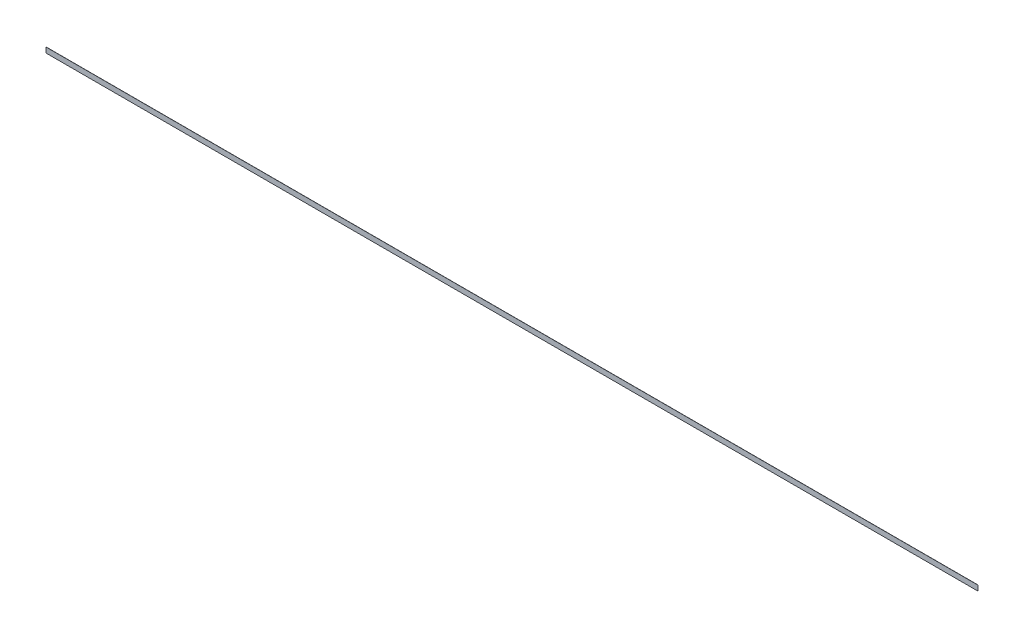
ISO-10303-21;
HEADER;
FILE_DESCRIPTION(('STEP AP214'),'2;1');
FILE_NAME('part.step','',(''),(''),'','','');
FILE_SCHEMA(('AUTOMOTIVE_DESIGN { 1 0 10303 214 1 1 1 1 }'));
ENDSEC;
DATA;
#1=APPLICATION_CONTEXT('core data for automotive mechanical design processes');
#2=APPLICATION_PROTOCOL_DEFINITION('international standard','automotive_design',2000,#1);
#3=PRODUCT_CONTEXT('',#1,'mechanical');
#4=PRODUCT('Part','Part','',(#3));
#5=PRODUCT_RELATED_PRODUCT_CATEGORY('part','',(#4));
#6=PRODUCT_DEFINITION_FORMATION('','',#4);
#7=PRODUCT_DEFINITION_CONTEXT('part definition',#1,'design');
#8=PRODUCT_DEFINITION('design','',#6,#7);
#9=PRODUCT_DEFINITION_SHAPE('','',#8);
#10=(LENGTH_UNIT() NAMED_UNIT(*) SI_UNIT(.MILLI.,.METRE.));
#11=(NAMED_UNIT(*) PLANE_ANGLE_UNIT() SI_UNIT($,.RADIAN.));
#12=(NAMED_UNIT(*) SI_UNIT($,.STERADIAN.) SOLID_ANGLE_UNIT());
#13=UNCERTAINTY_MEASURE_WITH_UNIT(LENGTH_MEASURE(1.E-05),#10,'distance_accuracy_value','');
#14=(GEOMETRIC_REPRESENTATION_CONTEXT(3) GLOBAL_UNCERTAINTY_ASSIGNED_CONTEXT((#13)) GLOBAL_UNIT_ASSIGNED_CONTEXT((#10,
#11,#12)) REPRESENTATION_CONTEXT('',''));
#15=CARTESIAN_POINT('',(0.,0.,0.));
#16=DIRECTION('',(0.,0.,1.));
#17=DIRECTION('',(1.,0.,0.));
#18=AXIS2_PLACEMENT_3D('',#15,#16,#17);
#19=CARTESIAN_POINT('',(-4761.02167367934,852.935817998678,0.));
#20=DIRECTION('',(0.,0.,1.));
#21=DIRECTION('',(1.,0.,0.));
#22=AXIS2_PLACEMENT_3D('',#19,#20,#21);
#23=PLANE('',#22);
#24=DIRECTION('',(1.,0.,0.));
#25=VECTOR('',#24,1.);
#26=CARTESIAN_POINT('',(-4761.02167367934,827.535817998678,0.));
#27=LINE('',#26,#25);
#28=CARTESIAN_POINT('',(-290.621673679351,827.535817998678,0.));
#29=VERTEX_POINT('',#28);
#30=CARTESIAN_POINT('',(-9333.02167367934,827.535817998678,0.));
#31=VERTEX_POINT('',#30);
#32=EDGE_CURVE('E20',#29,#31,#27,.F.);
#33=ORIENTED_EDGE('',*,*,#32,.T.);
#34=DIRECTION('',(0.,1.,0.));
#35=VECTOR('',#34,1.);
#36=CARTESIAN_POINT('',(-9333.02167367934,852.935817998678,0.));
#37=LINE('',#36,#35);
#38=CARTESIAN_POINT('',(-9333.02167367934,878.335817998678,0.));
#39=VERTEX_POINT('',#38);
#40=EDGE_CURVE('E79',#31,#39,#37,.T.);
#41=ORIENTED_EDGE('',*,*,#40,.T.);
#42=DIRECTION('',(1.,0.,0.));
#43=VECTOR('',#42,1.);
#44=CARTESIAN_POINT('',(-4761.02167367934,878.335817998678,0.));
#45=LINE('',#44,#43);
#46=CARTESIAN_POINT('',(-290.621673679351,878.335817998678,0.));
#47=VERTEX_POINT('',#46);
#48=EDGE_CURVE('E68',#47,#39,#45,.F.);
#49=ORIENTED_EDGE('',*,*,#48,.F.);
#50=DIRECTION('',(0.,1.,0.));
#51=VECTOR('',#50,1.);
#52=CARTESIAN_POINT('',(-290.621673679351,852.935817998678,0.));
#53=LINE('',#52,#51);
#54=EDGE_CURVE('E56',#29,#47,#53,.T.);
#55=ORIENTED_EDGE('',*,*,#54,.F.);
#56=EDGE_LOOP('',(#33,#41,#49,#55));
#57=FACE_BOUND('',#56,.T.);
#58=ADVANCED_FACE('F17',(#57),#23,.F.);
#59=CARTESIAN_POINT('',(-4761.02167367934,827.535817998678,3.175));
#60=DIRECTION('',(0.,1.,0.));
#61=DIRECTION('',(0.,0.,1.));
#62=AXIS2_PLACEMENT_3D('',#59,#60,#61);
#63=PLANE('',#62);
#64=DIRECTION('',(1.,0.,0.));
#65=VECTOR('',#64,1.);
#66=CARTESIAN_POINT('',(-4761.02167367934,827.535817998678,1.5875));
#67=LINE('',#66,#65);
#68=CARTESIAN_POINT('',(-9333.02167367934,827.535817998678,1.5875));
#69=VERTEX_POINT('',#68);
#70=CARTESIAN_POINT('',(-290.621673679351,827.535817998678,1.5875));
#71=VERTEX_POINT('',#70);
#72=EDGE_CURVE('E83',#69,#71,#67,.T.);
#73=ORIENTED_EDGE('',*,*,#72,.F.);
#74=DIRECTION('',(0.,0.,-1.));
#75=VECTOR('',#74,1.);
#76=CARTESIAN_POINT('',(-9333.02167367934,827.535817998678,3.175));
#77=LINE('',#76,#75);
#78=EDGE_CURVE('E65',#69,#31,#77,.T.);
#79=ORIENTED_EDGE('',*,*,#78,.T.);
#80=ORIENTED_EDGE('',*,*,#32,.F.);
#81=DIRECTION('',(0.,0.,-1.));
#82=VECTOR('',#81,1.);
#83=CARTESIAN_POINT('',(-290.621673679351,827.535817998678,3.175));
#84=LINE('',#83,#82);
#85=EDGE_CURVE('E62',#71,#29,#84,.T.);
#86=ORIENTED_EDGE('',*,*,#85,.F.);
#87=EDGE_LOOP('',(#73,#79,#80,#86));
#88=FACE_BOUND('',#87,.T.);
#89=ADVANCED_FACE('F61',(#88),#63,.F.);
#90=CARTESIAN_POINT('',(-290.621673679351,852.935817998678,3.175));
#91=DIRECTION('',(1.,0.,0.));
#92=DIRECTION('',(0.,0.,-1.));
#93=AXIS2_PLACEMENT_3D('',#90,#91,#92);
#94=PLANE('',#93);
#95=ORIENTED_EDGE('',*,*,#54,.T.);
#96=DIRECTION('',(0.,0.,1.));
#97=VECTOR('',#96,1.);
#98=CARTESIAN_POINT('',(-290.621673679351,878.335817998678,3.175));
#99=LINE('',#98,#97);
#100=CARTESIAN_POINT('',(-290.621673679351,878.335817998678,1.5875));
#101=VERTEX_POINT('',#100);
#102=EDGE_CURVE('E70',#101,#47,#99,.F.);
#103=ORIENTED_EDGE('',*,*,#102,.F.);
#104=DIRECTION('',(0.,1.,0.));
#105=VECTOR('',#104,1.);
#106=CARTESIAN_POINT('',(-290.621673679351,852.935817998678,1.5875));
#107=LINE('',#106,#105);
#108=EDGE_CURVE('E74',#71,#101,#107,.T.);
#109=ORIENTED_EDGE('',*,*,#108,.F.);
#110=ORIENTED_EDGE('',*,*,#85,.T.);
#111=EDGE_LOOP('',(#95,#103,#109,#110));
#112=FACE_BOUND('',#111,.T.);
#113=ADVANCED_FACE('F72',(#112),#94,.T.);
#114=CARTESIAN_POINT('',(-4761.02167367934,878.335817998678,3.175));
#115=DIRECTION('',(0.,1.,0.));
#116=DIRECTION('',(0.,0.,1.));
#117=AXIS2_PLACEMENT_3D('',#114,#115,#116);
#118=PLANE('',#117);
#119=ORIENTED_EDGE('',*,*,#48,.T.);
#120=DIRECTION('',(0.,0.,-1.));
#121=VECTOR('',#120,1.);
#122=CARTESIAN_POINT('',(-9333.02167367934,878.335817998678,3.175));
#123=LINE('',#122,#121);
#124=CARTESIAN_POINT('',(-9333.02167367934,878.335817998678,1.5875));
#125=VERTEX_POINT('',#124);
#126=EDGE_CURVE('E35',#39,#125,#123,.F.);
#127=ORIENTED_EDGE('',*,*,#126,.T.);
#128=DIRECTION('',(1.,0.,0.));
#129=VECTOR('',#128,1.);
#130=CARTESIAN_POINT('',(-4761.02167367934,878.335817998678,1.5875));
#131=LINE('',#130,#129);
#132=EDGE_CURVE('E26',#101,#125,#131,.F.);
#133=ORIENTED_EDGE('',*,*,#132,.F.);
#134=ORIENTED_EDGE('',*,*,#102,.T.);
#135=EDGE_LOOP('',(#119,#127,#133,#134));
#136=FACE_BOUND('',#135,.T.);
#137=ADVANCED_FACE('F89',(#136),#118,.T.);
#138=CARTESIAN_POINT('',(-9333.02167367934,852.935817998678,3.175));
#139=DIRECTION('',(1.,0.,0.));
#140=DIRECTION('',(0.,0.,-1.));
#141=AXIS2_PLACEMENT_3D('',#138,#139,#140);
#142=PLANE('',#141);
#143=DIRECTION('',(0.,1.,0.));
#144=VECTOR('',#143,1.);
#145=CARTESIAN_POINT('',(-9333.02167367934,852.935817998678,1.5875));
#146=LINE('',#145,#144);
#147=EDGE_CURVE('E11',#125,#69,#146,.F.);
#148=ORIENTED_EDGE('',*,*,#147,.F.);
#149=ORIENTED_EDGE('',*,*,#126,.F.);
#150=ORIENTED_EDGE('',*,*,#40,.F.);
#151=ORIENTED_EDGE('',*,*,#78,.F.);
#152=EDGE_LOOP('',(#148,#149,#150,#151));
#153=FACE_BOUND('',#152,.T.);
#154=ADVANCED_FACE('F91',(#153),#142,.F.);
#155=CARTESIAN_POINT('',(-4761.02167367934,852.935817998678,1.5875));
#156=DIRECTION('',(0.,0.,1.));
#157=DIRECTION('',(1.,0.,0.));
#158=AXIS2_PLACEMENT_3D('',#155,#156,#157);
#159=PLANE('',#158);
#160=ORIENTED_EDGE('',*,*,#132,.T.);
#161=ORIENTED_EDGE('',*,*,#147,.T.);
#162=ORIENTED_EDGE('',*,*,#72,.T.);
#163=ORIENTED_EDGE('',*,*,#108,.T.);
#164=EDGE_LOOP('',(#160,#161,#162,#163));
#165=FACE_BOUND('',#164,.T.);
#166=ADVANCED_FACE('F88',(#165),#159,.T.);
#167=CLOSED_SHELL('',(#58,#89,#113,#137,#154,#166));
#168=MANIFOLD_SOLID_BREP('B1',#167);
#169=ADVANCED_BREP_SHAPE_REPRESENTATION('',(#18,#168),#14);
#170=SHAPE_DEFINITION_REPRESENTATION(#9,#169);
ENDSEC;
END-ISO-10303-21;
